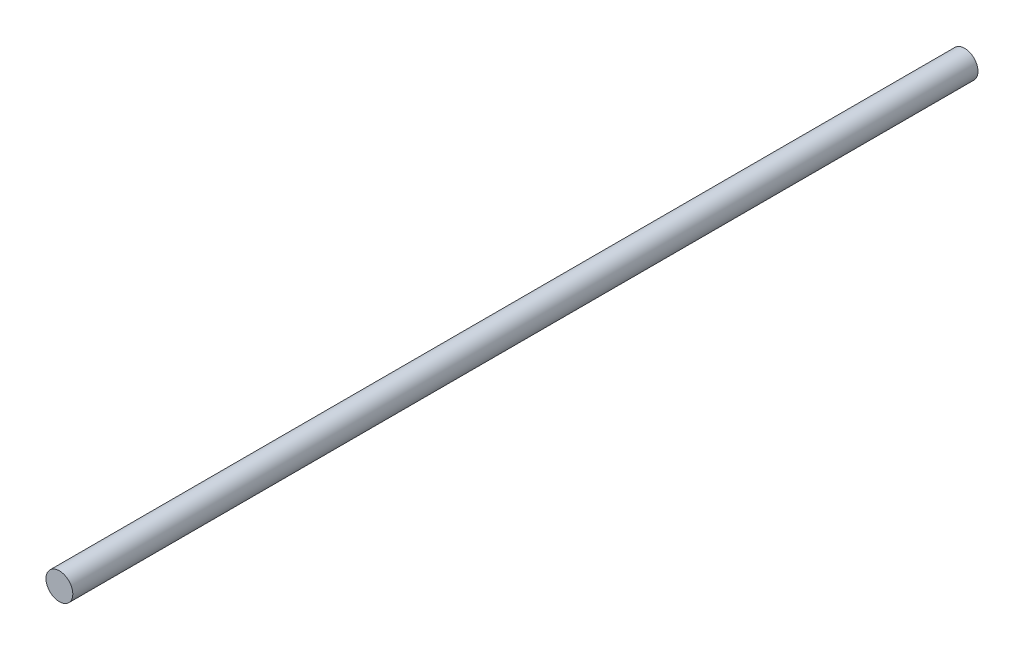
ISO-10303-21;
HEADER;
FILE_DESCRIPTION(('STEP AP214'),'2;1');
FILE_NAME('part.step','',(''),(''),'','','');
FILE_SCHEMA(('AUTOMOTIVE_DESIGN { 1 0 10303 214 1 1 1 1 }'));
ENDSEC;
DATA;
#1=APPLICATION_CONTEXT('core data for automotive mechanical design processes');
#2=APPLICATION_PROTOCOL_DEFINITION('international standard','automotive_design',2000,#1);
#3=PRODUCT_CONTEXT('',#1,'mechanical');
#4=PRODUCT('Part','Part','',(#3));
#5=PRODUCT_RELATED_PRODUCT_CATEGORY('part','',(#4));
#6=PRODUCT_DEFINITION_FORMATION('','',#4);
#7=PRODUCT_DEFINITION_CONTEXT('part definition',#1,'design');
#8=PRODUCT_DEFINITION('design','',#6,#7);
#9=PRODUCT_DEFINITION_SHAPE('','',#8);
#10=(LENGTH_UNIT() NAMED_UNIT(*) SI_UNIT(.MILLI.,.METRE.));
#11=(NAMED_UNIT(*) PLANE_ANGLE_UNIT() SI_UNIT($,.RADIAN.));
#12=(NAMED_UNIT(*) SI_UNIT($,.STERADIAN.) SOLID_ANGLE_UNIT());
#13=UNCERTAINTY_MEASURE_WITH_UNIT(LENGTH_MEASURE(1.E-05),#10,'distance_accuracy_value','');
#14=(GEOMETRIC_REPRESENTATION_CONTEXT(3) GLOBAL_UNCERTAINTY_ASSIGNED_CONTEXT((#13)) GLOBAL_UNIT_ASSIGNED_CONTEXT((#10,
#11,#12)) REPRESENTATION_CONTEXT('',''));
#15=CARTESIAN_POINT('',(0.,0.,0.));
#16=DIRECTION('',(0.,0.,1.));
#17=DIRECTION('',(1.,0.,0.));
#18=AXIS2_PLACEMENT_3D('',#15,#16,#17);
#19=CARTESIAN_POINT('',(0.,0.,135.));
#20=DIRECTION('',(0.,0.,-1.));
#21=DIRECTION('',(-1.,0.,0.));
#22=AXIS2_PLACEMENT_3D('',#19,#20,#21);
#23=CYLINDRICAL_SURFACE('',#22,2.);
#24=CARTESIAN_POINT('',(0.,0.,135.));
#25=DIRECTION('',(0.,0.,1.));
#26=DIRECTION('',(1.,0.,0.));
#27=AXIS2_PLACEMENT_3D('',#24,#25,#26);
#28=CIRCLE('',#27,2.);
#29=CARTESIAN_POINT('',(2.,0.,135.));
#30=VERTEX_POINT('',#29);
#31=EDGE_CURVE('E10',#30,#30,#28,.T.);
#32=ORIENTED_EDGE('',*,*,#31,.F.);
#33=EDGE_LOOP('',(#32));
#34=FACE_BOUND('',#33,.T.);
#35=CARTESIAN_POINT('',(0.,0.,0.));
#36=DIRECTION('',(0.,0.,1.));
#37=DIRECTION('',(1.,0.,0.));
#38=AXIS2_PLACEMENT_3D('',#35,#36,#37);
#39=CIRCLE('',#38,2.);
#40=CARTESIAN_POINT('',(2.,0.,0.));
#41=VERTEX_POINT('',#40);
#42=EDGE_CURVE('E33',#41,#41,#39,.T.);
#43=ORIENTED_EDGE('',*,*,#42,.T.);
#44=EDGE_LOOP('',(#43));
#45=FACE_BOUND('',#44,.T.);
#46=ADVANCED_FACE('F30',(#34,#45),#23,.T.);
#47=CARTESIAN_POINT('',(0.,0.,135.));
#48=DIRECTION('',(0.,0.,1.));
#49=DIRECTION('',(1.,0.,0.));
#50=AXIS2_PLACEMENT_3D('',#47,#48,#49);
#51=PLANE('',#50);
#52=ORIENTED_EDGE('',*,*,#31,.T.);
#53=EDGE_LOOP('',(#52));
#54=FACE_BOUND('',#53,.T.);
#55=ADVANCED_FACE('F45',(#54),#51,.T.);
#56=CARTESIAN_POINT('',(0.,0.,0.));
#57=DIRECTION('',(0.,0.,1.));
#58=DIRECTION('',(1.,0.,0.));
#59=AXIS2_PLACEMENT_3D('',#56,#57,#58);
#60=PLANE('',#59);
#61=ORIENTED_EDGE('',*,*,#42,.F.);
#62=EDGE_LOOP('',(#61));
#63=FACE_BOUND('',#62,.T.);
#64=ADVANCED_FACE('F43',(#63),#60,.F.);
#65=CLOSED_SHELL('',(#46,#55,#64));
#66=MANIFOLD_SOLID_BREP('B2',#65);
#67=ADVANCED_BREP_SHAPE_REPRESENTATION('',(#18,#66),#14);
#68=SHAPE_DEFINITION_REPRESENTATION(#9,#67);
ENDSEC;
END-ISO-10303-21;
